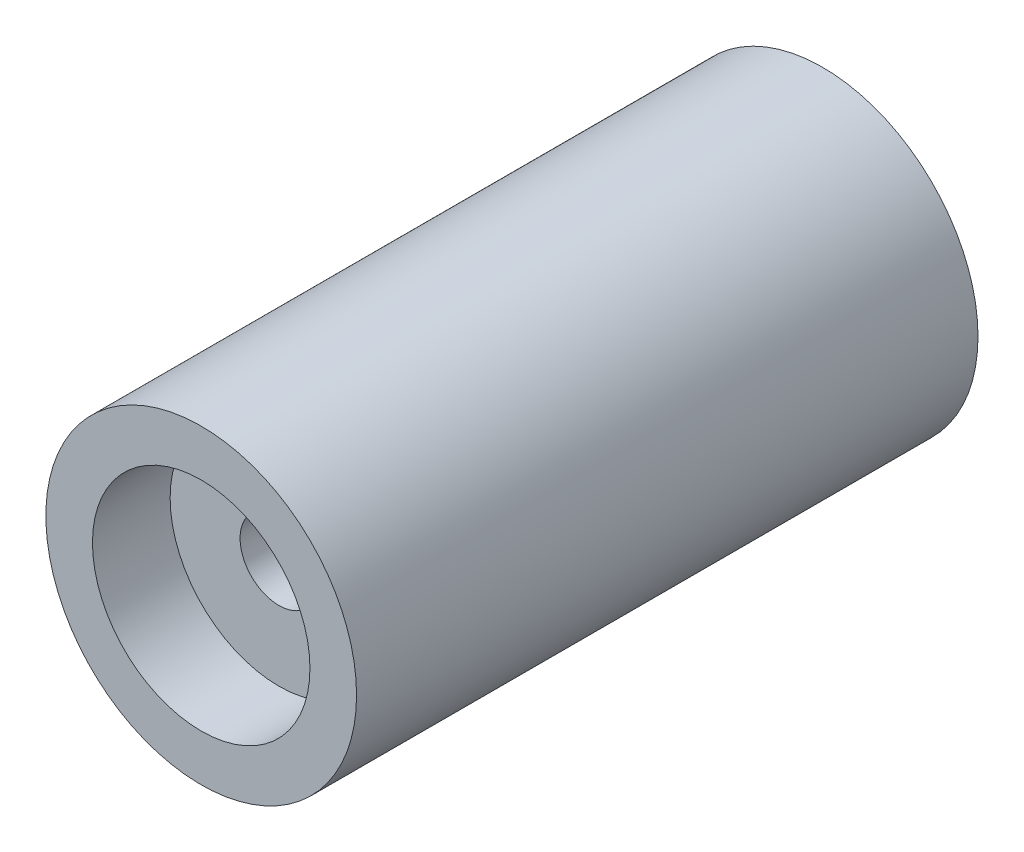
ISO-10303-21;
HEADER;
FILE_DESCRIPTION(('STEP AP214'),'2;1');
FILE_NAME('part.step','',(''),(''),'','','');
FILE_SCHEMA(('AUTOMOTIVE_DESIGN { 1 0 10303 214 1 1 1 1 }'));
ENDSEC;
DATA;
#1=APPLICATION_CONTEXT('core data for automotive mechanical design processes');
#2=APPLICATION_PROTOCOL_DEFINITION('international standard','automotive_design',2000,#1);
#3=PRODUCT_CONTEXT('',#1,'mechanical');
#4=PRODUCT('Part','Part','',(#3));
#5=PRODUCT_RELATED_PRODUCT_CATEGORY('part','',(#4));
#6=PRODUCT_DEFINITION_FORMATION('','',#4);
#7=PRODUCT_DEFINITION_CONTEXT('part definition',#1,'design');
#8=PRODUCT_DEFINITION('design','',#6,#7);
#9=PRODUCT_DEFINITION_SHAPE('','',#8);
#10=(LENGTH_UNIT() NAMED_UNIT(*) SI_UNIT(.MILLI.,.METRE.));
#11=(NAMED_UNIT(*) PLANE_ANGLE_UNIT() SI_UNIT($,.RADIAN.));
#12=(NAMED_UNIT(*) SI_UNIT($,.STERADIAN.) SOLID_ANGLE_UNIT());
#13=UNCERTAINTY_MEASURE_WITH_UNIT(LENGTH_MEASURE(1.E-05),#10,'distance_accuracy_value','');
#14=(GEOMETRIC_REPRESENTATION_CONTEXT(3) GLOBAL_UNCERTAINTY_ASSIGNED_CONTEXT((#13)) GLOBAL_UNIT_ASSIGNED_CONTEXT((#10,
#11,#12)) REPRESENTATION_CONTEXT('',''));
#15=CARTESIAN_POINT('',(0.,0.,0.));
#16=DIRECTION('',(0.,0.,1.));
#17=DIRECTION('',(1.,0.,0.));
#18=AXIS2_PLACEMENT_3D('',#15,#16,#17);
#19=CARTESIAN_POINT('',(0.,0.,40.));
#20=DIRECTION('',(0.,0.,-1.));
#21=DIRECTION('',(-1.,0.,0.));
#22=AXIS2_PLACEMENT_3D('',#19,#20,#21);
#23=CYLINDRICAL_SURFACE('',#22,2.5);
#24=CARTESIAN_POINT('',(0.,0.,5.));
#25=DIRECTION('',(0.,0.,-1.));
#26=DIRECTION('',(-1.,0.,0.));
#27=AXIS2_PLACEMENT_3D('',#24,#25,#26);
#28=CIRCLE('',#27,2.5);
#29=CARTESIAN_POINT('',(-2.5,0.,5.));
#30=VERTEX_POINT('',#29);
#31=EDGE_CURVE('E44',#30,#30,#28,.T.);
#32=ORIENTED_EDGE('',*,*,#31,.T.);
#33=EDGE_LOOP('',(#32));
#34=FACE_BOUND('',#33,.T.);
#35=CARTESIAN_POINT('',(0.,0.,35.));
#36=DIRECTION('',(0.,0.,1.));
#37=DIRECTION('',(1.,0.,0.));
#38=AXIS2_PLACEMENT_3D('',#35,#36,#37);
#39=CIRCLE('',#38,2.5);
#40=CARTESIAN_POINT('',(2.5,0.,35.));
#41=VERTEX_POINT('',#40);
#42=EDGE_CURVE('E35',#41,#41,#39,.T.);
#43=ORIENTED_EDGE('',*,*,#42,.T.);
#44=EDGE_LOOP('',(#43));
#45=FACE_BOUND('',#44,.T.);
#46=ADVANCED_FACE('F31',(#34,#45),#23,.F.);
#47=CARTESIAN_POINT('',(0.,0.,40.));
#48=DIRECTION('',(0.,0.,1.));
#49=DIRECTION('',(1.,0.,0.));
#50=AXIS2_PLACEMENT_3D('',#47,#48,#49);
#51=PLANE('',#50);
#52=CARTESIAN_POINT('',(0.,0.,40.));
#53=DIRECTION('',(0.,0.,-1.));
#54=DIRECTION('',(-1.,0.,0.));
#55=AXIS2_PLACEMENT_3D('',#52,#53,#54);
#56=CIRCLE('',#55,7.);
#57=CARTESIAN_POINT('',(-7.,0.,40.));
#58=VERTEX_POINT('',#57);
#59=EDGE_CURVE('E58',#58,#58,#56,.T.);
#60=ORIENTED_EDGE('',*,*,#59,.T.);
#61=EDGE_LOOP('',(#60));
#62=FACE_BOUND('',#61,.T.);
#63=CARTESIAN_POINT('',(0.,0.,40.));
#64=DIRECTION('',(0.,0.,1.));
#65=DIRECTION('',(1.,0.,0.));
#66=AXIS2_PLACEMENT_3D('',#63,#64,#65);
#67=CIRCLE('',#66,10.);
#68=CARTESIAN_POINT('',(10.,0.,40.));
#69=VERTEX_POINT('',#68);
#70=EDGE_CURVE('E10',#69,#69,#67,.T.);
#71=ORIENTED_EDGE('',*,*,#70,.T.);
#72=EDGE_LOOP('',(#71));
#73=FACE_BOUND('',#72,.T.);
#74=ADVANCED_FACE('F80',(#62,#73),#51,.T.);
#75=CARTESIAN_POINT('',(0.,0.,0.));
#76=DIRECTION('',(0.,0.,1.));
#77=DIRECTION('',(1.,0.,0.));
#78=AXIS2_PLACEMENT_3D('',#75,#76,#77);
#79=PLANE('',#78);
#80=CARTESIAN_POINT('',(0.,0.,0.));
#81=DIRECTION('',(0.,0.,-1.));
#82=DIRECTION('',(-1.,0.,0.));
#83=AXIS2_PLACEMENT_3D('',#80,#81,#82);
#84=CIRCLE('',#83,7.);
#85=CARTESIAN_POINT('',(-7.,0.,0.));
#86=VERTEX_POINT('',#85);
#87=EDGE_CURVE('E47',#86,#86,#84,.T.);
#88=ORIENTED_EDGE('',*,*,#87,.F.);
#89=EDGE_LOOP('',(#88));
#90=FACE_BOUND('',#89,.T.);
#91=CARTESIAN_POINT('',(0.,0.,0.));
#92=DIRECTION('',(0.,0.,1.));
#93=DIRECTION('',(1.,0.,0.));
#94=AXIS2_PLACEMENT_3D('',#91,#92,#93);
#95=CIRCLE('',#94,10.);
#96=CARTESIAN_POINT('',(10.,0.,0.));
#97=VERTEX_POINT('',#96);
#98=EDGE_CURVE('E39',#97,#97,#95,.T.);
#99=ORIENTED_EDGE('',*,*,#98,.F.);
#100=EDGE_LOOP('',(#99));
#101=FACE_BOUND('',#100,.T.);
#102=ADVANCED_FACE('F85',(#90,#101),#79,.F.);
#103=CARTESIAN_POINT('',(0.,0.,40.));
#104=DIRECTION('',(0.,0.,-1.));
#105=DIRECTION('',(-1.,0.,0.));
#106=AXIS2_PLACEMENT_3D('',#103,#104,#105);
#107=CYLINDRICAL_SURFACE('',#106,10.);
#108=ORIENTED_EDGE('',*,*,#70,.F.);
#109=EDGE_LOOP('',(#108));
#110=FACE_BOUND('',#109,.T.);
#111=ORIENTED_EDGE('',*,*,#98,.T.);
#112=EDGE_LOOP('',(#111));
#113=FACE_BOUND('',#112,.T.);
#114=ADVANCED_FACE('F33',(#110,#113),#107,.T.);
#115=CARTESIAN_POINT('',(0.,0.,5.));
#116=DIRECTION('',(0.,0.,-1.));
#117=DIRECTION('',(-1.,0.,0.));
#118=AXIS2_PLACEMENT_3D('',#115,#116,#117);
#119=CYLINDRICAL_SURFACE('',#118,7.);
#120=CARTESIAN_POINT('',(0.,0.,5.));
#121=DIRECTION('',(0.,0.,-1.));
#122=DIRECTION('',(-1.,0.,0.));
#123=AXIS2_PLACEMENT_3D('',#120,#121,#122);
#124=CIRCLE('',#123,7.);
#125=CARTESIAN_POINT('',(-7.,0.,5.));
#126=VERTEX_POINT('',#125);
#127=EDGE_CURVE('E50',#126,#126,#124,.T.);
#128=ORIENTED_EDGE('',*,*,#127,.F.);
#129=EDGE_LOOP('',(#128));
#130=FACE_BOUND('',#129,.T.);
#131=ORIENTED_EDGE('',*,*,#87,.T.);
#132=EDGE_LOOP('',(#131));
#133=FACE_BOUND('',#132,.T.);
#134=ADVANCED_FACE('F89',(#130,#133),#119,.F.);
#135=CARTESIAN_POINT('',(0.,0.,5.));
#136=DIRECTION('',(0.,0.,-1.));
#137=DIRECTION('',(-1.,0.,0.));
#138=AXIS2_PLACEMENT_3D('',#135,#136,#137);
#139=PLANE('',#138);
#140=ORIENTED_EDGE('',*,*,#31,.F.);
#141=EDGE_LOOP('',(#140));
#142=FACE_BOUND('',#141,.T.);
#143=ORIENTED_EDGE('',*,*,#127,.T.);
#144=EDGE_LOOP('',(#143));
#145=FACE_BOUND('',#144,.T.);
#146=ADVANCED_FACE('F77',(#142,#145),#139,.T.);
#147=CARTESIAN_POINT('',(0.,0.,35.));
#148=DIRECTION('',(0.,0.,1.));
#149=DIRECTION('',(1.,0.,0.));
#150=AXIS2_PLACEMENT_3D('',#147,#148,#149);
#151=CYLINDRICAL_SURFACE('',#150,7.);
#152=CARTESIAN_POINT('',(0.,0.,35.));
#153=DIRECTION('',(0.,0.,-1.));
#154=DIRECTION('',(-1.,0.,0.));
#155=AXIS2_PLACEMENT_3D('',#152,#153,#154);
#156=CIRCLE('',#155,7.);
#157=CARTESIAN_POINT('',(-7.,0.,35.));
#158=VERTEX_POINT('',#157);
#159=EDGE_CURVE('E61',#158,#158,#156,.T.);
#160=ORIENTED_EDGE('',*,*,#159,.T.);
#161=EDGE_LOOP('',(#160));
#162=FACE_BOUND('',#161,.T.);
#163=ORIENTED_EDGE('',*,*,#59,.F.);
#164=EDGE_LOOP('',(#163));
#165=FACE_BOUND('',#164,.T.);
#166=ADVANCED_FACE('F72',(#162,#165),#151,.F.);
#167=CARTESIAN_POINT('',(0.,0.,35.));
#168=DIRECTION('',(0.,0.,1.));
#169=DIRECTION('',(-1.,0.,0.));
#170=AXIS2_PLACEMENT_3D('',#167,#168,#169);
#171=PLANE('',#170);
#172=ORIENTED_EDGE('',*,*,#42,.F.);
#173=EDGE_LOOP('',(#172));
#174=FACE_BOUND('',#173,.T.);
#175=ORIENTED_EDGE('',*,*,#159,.F.);
#176=EDGE_LOOP('',(#175));
#177=FACE_BOUND('',#176,.T.);
#178=ADVANCED_FACE('F69',(#174,#177),#171,.T.);
#179=CLOSED_SHELL('',(#46,#74,#102,#114,#134,#146,#166,#178));
#180=MANIFOLD_SOLID_BREP('B2',#179);
#181=ADVANCED_BREP_SHAPE_REPRESENTATION('',(#18,#180),#14);
#182=SHAPE_DEFINITION_REPRESENTATION(#9,#181);
ENDSEC;
END-ISO-10303-21;
